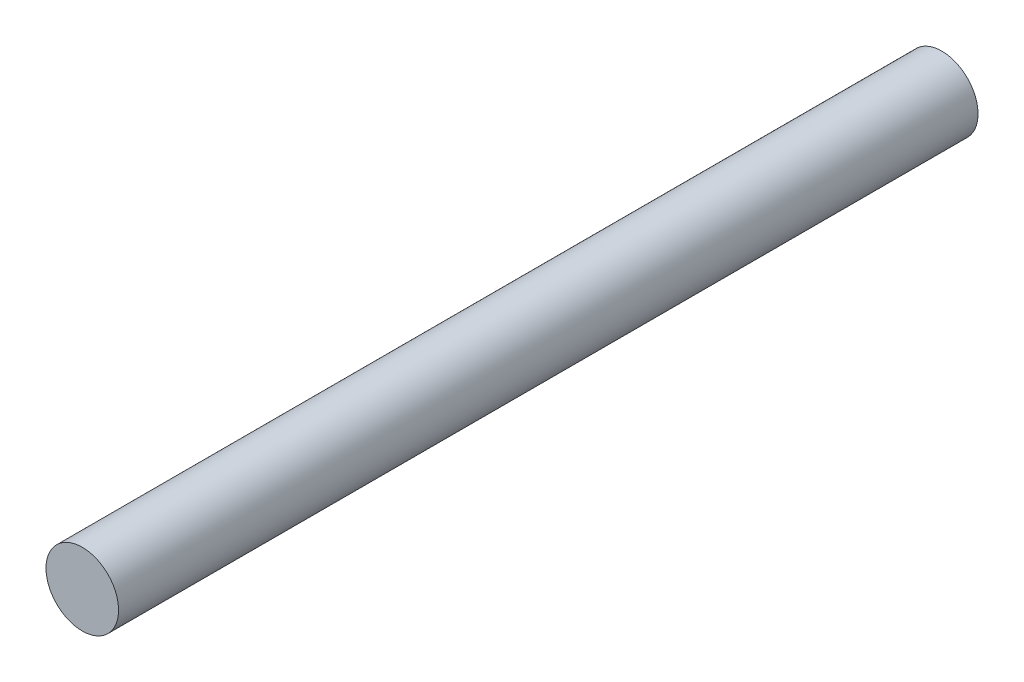
ISO-10303-21;
HEADER;
FILE_DESCRIPTION(('STEP AP214'),'2;1');
FILE_NAME('part.step','',(''),(''),'','','');
FILE_SCHEMA(('AUTOMOTIVE_DESIGN { 1 0 10303 214 1 1 1 1 }'));
ENDSEC;
DATA;
#1=APPLICATION_CONTEXT('core data for automotive mechanical design processes');
#2=APPLICATION_PROTOCOL_DEFINITION('international standard','automotive_design',2000,#1);
#3=PRODUCT_CONTEXT('',#1,'mechanical');
#4=PRODUCT('Part','Part','',(#3));
#5=PRODUCT_RELATED_PRODUCT_CATEGORY('part','',(#4));
#6=PRODUCT_DEFINITION_FORMATION('','',#4);
#7=PRODUCT_DEFINITION_CONTEXT('part definition',#1,'design');
#8=PRODUCT_DEFINITION('design','',#6,#7);
#9=PRODUCT_DEFINITION_SHAPE('','',#8);
#10=(LENGTH_UNIT() NAMED_UNIT(*) SI_UNIT(.MILLI.,.METRE.));
#11=(NAMED_UNIT(*) PLANE_ANGLE_UNIT() SI_UNIT($,.RADIAN.));
#12=(NAMED_UNIT(*) SI_UNIT($,.STERADIAN.) SOLID_ANGLE_UNIT());
#13=UNCERTAINTY_MEASURE_WITH_UNIT(LENGTH_MEASURE(1.E-05),#10,'distance_accuracy_value','');
#14=(GEOMETRIC_REPRESENTATION_CONTEXT(3) GLOBAL_UNCERTAINTY_ASSIGNED_CONTEXT((#13)) GLOBAL_UNIT_ASSIGNED_CONTEXT((#10,
#11,#12)) REPRESENTATION_CONTEXT('',''));
#15=CARTESIAN_POINT('',(0.,0.,0.));
#16=DIRECTION('',(0.,0.,1.));
#17=DIRECTION('',(1.,0.,0.));
#18=AXIS2_PLACEMENT_3D('',#15,#16,#17);
#19=CARTESIAN_POINT('',(0.,0.,90.));
#20=DIRECTION('',(0.,0.,-1.));
#21=DIRECTION('',(-1.,0.,0.));
#22=AXIS2_PLACEMENT_3D('',#19,#20,#21);
#23=CYLINDRICAL_SURFACE('',#22,3.8);
#24=CARTESIAN_POINT('',(0.,0.,90.));
#25=DIRECTION('',(0.,0.,1.));
#26=DIRECTION('',(1.,0.,0.));
#27=AXIS2_PLACEMENT_3D('',#24,#25,#26);
#28=CIRCLE('',#27,3.8);
#29=CARTESIAN_POINT('',(-3.8,0.,90.));
#30=VERTEX_POINT('',#29);
#31=EDGE_CURVE('E10',#30,#30,#28,.T.);
#32=CARTESIAN_POINT('',(0.,0.,0.));
#33=DIRECTION('',(0.,0.,1.));
#34=DIRECTION('',(1.,0.,0.));
#35=AXIS2_PLACEMENT_3D('',#32,#33,#34);
#36=CIRCLE('',#35,3.8);
#37=CARTESIAN_POINT('',(-3.8,0.,0.));
#38=VERTEX_POINT('',#37);
#39=EDGE_CURVE('E37',#38,#38,#36,.T.);
#40=CARTESIAN_POINT('',(-3.8,0.,90.));
#41=CARTESIAN_POINT('',(-3.8,0.,89.0625));
#42=CARTESIAN_POINT('',(-3.8,0.,88.125));
#43=CARTESIAN_POINT('',(-3.8,0.,86.25));
#44=CARTESIAN_POINT('',(-3.8,0.,85.3125));
#45=CARTESIAN_POINT('',(-3.8,0.,83.4375));
#46=CARTESIAN_POINT('',(-3.8,0.,82.5));
#47=CARTESIAN_POINT('',(-3.8,0.,80.625));
#48=CARTESIAN_POINT('',(-3.8,0.,79.6875));
#49=CARTESIAN_POINT('',(-3.8,0.,77.8125));
#50=CARTESIAN_POINT('',(-3.8,0.,76.875));
#51=CARTESIAN_POINT('',(-3.8,0.,75.));
#52=CARTESIAN_POINT('',(-3.8,0.,74.0625));
#53=CARTESIAN_POINT('',(-3.8,0.,72.1875));
#54=CARTESIAN_POINT('',(-3.8,0.,71.25));
#55=CARTESIAN_POINT('',(-3.8,0.,69.375));
#56=CARTESIAN_POINT('',(-3.8,0.,68.4375));
#57=CARTESIAN_POINT('',(-3.8,0.,66.5625));
#58=CARTESIAN_POINT('',(-3.8,0.,65.625));
#59=CARTESIAN_POINT('',(-3.8,0.,63.75));
#60=CARTESIAN_POINT('',(-3.8,0.,62.8125));
#61=CARTESIAN_POINT('',(-3.8,0.,60.9375));
#62=CARTESIAN_POINT('',(-3.8,0.,60.));
#63=CARTESIAN_POINT('',(-3.8,0.,58.125));
#64=CARTESIAN_POINT('',(-3.8,0.,57.1875));
#65=CARTESIAN_POINT('',(-3.8,0.,55.3125));
#66=CARTESIAN_POINT('',(-3.8,0.,54.375));
#67=CARTESIAN_POINT('',(-3.8,0.,52.5));
#68=CARTESIAN_POINT('',(-3.8,0.,51.5625));
#69=CARTESIAN_POINT('',(-3.8,0.,49.6875));
#70=CARTESIAN_POINT('',(-3.8,0.,48.75));
#71=CARTESIAN_POINT('',(-3.8,0.,46.875));
#72=CARTESIAN_POINT('',(-3.8,0.,45.9375));
#73=CARTESIAN_POINT('',(-3.8,0.,44.0625));
#74=CARTESIAN_POINT('',(-3.8,0.,43.125));
#75=CARTESIAN_POINT('',(-3.8,0.,41.25));
#76=CARTESIAN_POINT('',(-3.8,0.,40.3125));
#77=CARTESIAN_POINT('',(-3.8,0.,38.4375));
#78=CARTESIAN_POINT('',(-3.8,0.,37.5));
#79=CARTESIAN_POINT('',(-3.8,0.,35.625));
#80=CARTESIAN_POINT('',(-3.8,0.,34.6875));
#81=CARTESIAN_POINT('',(-3.8,0.,32.8125));
#82=CARTESIAN_POINT('',(-3.8,0.,31.875));
#83=CARTESIAN_POINT('',(-3.8,0.,30.));
#84=CARTESIAN_POINT('',(-3.8,0.,29.0625));
#85=CARTESIAN_POINT('',(-3.8,0.,27.1875));
#86=CARTESIAN_POINT('',(-3.8,0.,26.25));
#87=CARTESIAN_POINT('',(-3.8,0.,24.375));
#88=CARTESIAN_POINT('',(-3.8,0.,23.4375));
#89=CARTESIAN_POINT('',(-3.8,0.,21.5625));
#90=CARTESIAN_POINT('',(-3.8,0.,20.625));
#91=CARTESIAN_POINT('',(-3.8,0.,18.75));
#92=CARTESIAN_POINT('',(-3.8,0.,17.8125));
#93=CARTESIAN_POINT('',(-3.8,0.,15.9375));
#94=CARTESIAN_POINT('',(-3.8,0.,15.));
#95=CARTESIAN_POINT('',(-3.8,0.,13.125));
#96=CARTESIAN_POINT('',(-3.8,0.,12.1875));
#97=CARTESIAN_POINT('',(-3.8,0.,10.3125));
#98=CARTESIAN_POINT('',(-3.8,0.,9.37499999999999));
#99=CARTESIAN_POINT('',(-3.8,0.,7.49999999999999));
#100=CARTESIAN_POINT('',(-3.8,0.,6.56249999999999));
#101=CARTESIAN_POINT('',(-3.8,0.,4.68749999999999));
#102=CARTESIAN_POINT('',(-3.8,0.,3.74999999999998));
#103=CARTESIAN_POINT('',(-3.8,0.,1.87499999999998));
#104=CARTESIAN_POINT('',(-3.8,0.,0.937499999999986));
#105=CARTESIAN_POINT('',(-3.8,0.,0.));
#106=B_SPLINE_CURVE_WITH_KNOTS('',3,(#40,#41,#42,#43,#44,#45,#46,#47,#48,#49,#50,#51,#52,#53,
#54,#55,#56,#57,#58,#59,#60,#61,#62,#63,#64,#65,#66,#67,#68,#69,#70,#71,#72,#73,#74,#75,#76,#77,
#78,#79,#80,#81,#82,#83,#84,#85,#86,#87,#88,#89,#90,#91,#92,#93,#94,#95,#96,#97,#98,#99,#100,
#101,#102,#103,#104,#105),.UNSPECIFIED.,.F.,.F.,(4,2,2,2,2,2,2,2,2,2,2,2,2,2,2,2,2,2,2,2,2,2,2,
2,2,2,2,2,2,2,2,2,4),(0.,2.81250000000001,5.62500000000001,8.43750000000001,11.25,14.0625,
16.875,19.6875,22.5,25.3125,28.125,30.9375,33.75,36.5625,39.375,42.1875,45.,47.8125,50.625,
53.4375,56.25,59.0625,61.875,64.6875,67.5,70.3125,73.125,75.9375,78.75,81.5625,84.375,87.1875,
90.),.UNSPECIFIED.);
#107=EDGE_CURVE('BSEAM34',#30,#38,#106,.T.);
#108=ORIENTED_EDGE('',*,*,#31,.F.);
#109=ORIENTED_EDGE('',*,*,#39,.T.);
#110=ORIENTED_EDGE('',*,*,#107,.T.);
#111=ORIENTED_EDGE('',*,*,#107,.F.);
#112=EDGE_LOOP('',(#108,#110,#109,#111));
#113=FACE_BOUND('',#112,.T.);
#114=ADVANCED_FACE('F34',(#113),#23,.T.);
#115=CARTESIAN_POINT('',(0.,0.,90.));
#116=DIRECTION('',(0.,0.,1.));
#117=DIRECTION('',(1.,0.,0.));
#118=AXIS2_PLACEMENT_3D('',#115,#116,#117);
#119=PLANE('',#118);
#120=ORIENTED_EDGE('',*,*,#31,.T.);
#121=EDGE_LOOP('',(#120));
#122=FACE_BOUND('',#121,.T.);
#123=ADVANCED_FACE('F49',(#122),#119,.T.);
#124=CARTESIAN_POINT('',(0.,0.,0.));
#125=DIRECTION('',(0.,0.,1.));
#126=DIRECTION('',(1.,0.,0.));
#127=AXIS2_PLACEMENT_3D('',#124,#125,#126);
#128=PLANE('',#127);
#129=ORIENTED_EDGE('',*,*,#39,.F.);
#130=EDGE_LOOP('',(#129));
#131=FACE_BOUND('',#130,.T.);
#132=ADVANCED_FACE('F47',(#131),#128,.F.);
#133=CLOSED_SHELL('',(#114,#123,#132));
#134=MANIFOLD_SOLID_BREP('B2',#133);
#135=ADVANCED_BREP_SHAPE_REPRESENTATION('',(#18,#134),#14);
#136=SHAPE_DEFINITION_REPRESENTATION(#9,#135);
ENDSEC;
END-ISO-10303-21;
